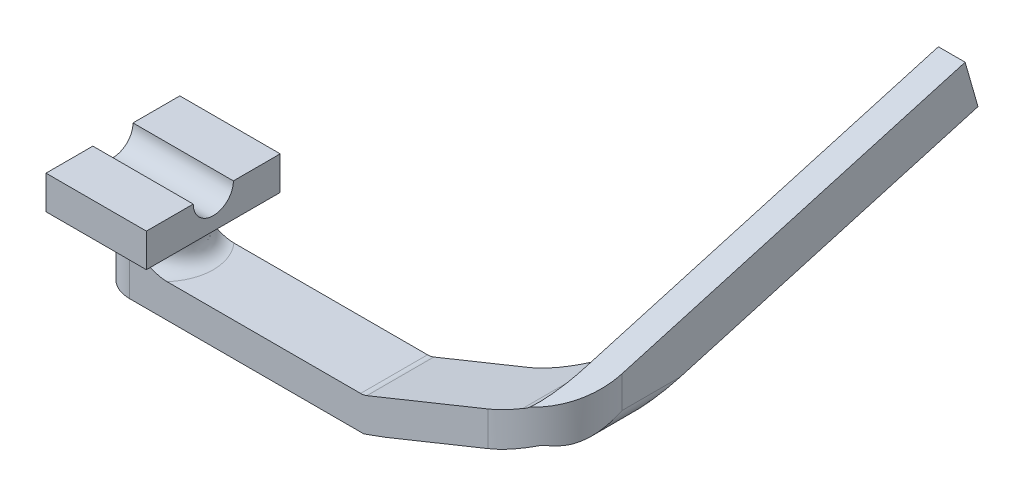
ISO-10303-21;
HEADER;
FILE_DESCRIPTION(('STEP AP214'),'2;1');
FILE_NAME('part.step','',(''),(''),'','','');
FILE_SCHEMA(('AUTOMOTIVE_DESIGN { 1 0 10303 214 1 1 1 1 }'));
ENDSEC;
DATA;
#1=APPLICATION_CONTEXT('core data for automotive mechanical design processes');
#2=APPLICATION_PROTOCOL_DEFINITION('international standard','automotive_design',2000,#1);
#3=PRODUCT_CONTEXT('',#1,'mechanical');
#4=PRODUCT('Part','Part','',(#3));
#5=PRODUCT_RELATED_PRODUCT_CATEGORY('part','',(#4));
#6=PRODUCT_DEFINITION_FORMATION('','',#4);
#7=PRODUCT_DEFINITION_CONTEXT('part definition',#1,'design');
#8=PRODUCT_DEFINITION('design','',#6,#7);
#9=PRODUCT_DEFINITION_SHAPE('','',#8);
#10=(LENGTH_UNIT() NAMED_UNIT(*) SI_UNIT(.MILLI.,.METRE.));
#11=(NAMED_UNIT(*) PLANE_ANGLE_UNIT() SI_UNIT($,.RADIAN.));
#12=(NAMED_UNIT(*) SI_UNIT($,.STERADIAN.) SOLID_ANGLE_UNIT());
#13=UNCERTAINTY_MEASURE_WITH_UNIT(LENGTH_MEASURE(1.E-05),#10,'distance_accuracy_value','');
#14=(GEOMETRIC_REPRESENTATION_CONTEXT(3) GLOBAL_UNCERTAINTY_ASSIGNED_CONTEXT((#13)) GLOBAL_UNIT_ASSIGNED_CONTEXT((#10,
#11,#12)) REPRESENTATION_CONTEXT('',''));
#15=CARTESIAN_POINT('',(0.,0.,0.));
#16=DIRECTION('',(0.,0.,1.));
#17=DIRECTION('',(1.,0.,0.));
#18=AXIS2_PLACEMENT_3D('',#15,#16,#17);
#19=CARTESIAN_POINT('',(0.,0.,0.));
#20=DIRECTION('',(0.,1.,0.));
#21=DIRECTION('',(0.,0.,-1.));
#22=AXIS2_PLACEMENT_3D('',#19,#20,#21);
#23=PLANE('',#22);
#24=DIRECTION('',(0.,0.,-1.));
#25=VECTOR('',#24,1.);
#26=CARTESIAN_POINT('',(-15.,0.,20.));
#27=LINE('',#26,#25);
#28=CARTESIAN_POINT('',(-15.,0.,0.));
#29=VERTEX_POINT('',#28);
#30=CARTESIAN_POINT('',(-15.,0.,-20.));
#31=VERTEX_POINT('',#30);
#32=EDGE_CURVE('E327',#29,#31,#27,.T.);
#33=ORIENTED_EDGE('',*,*,#32,.T.);
#34=DIRECTION('',(1.,0.,0.));
#35=VECTOR('',#34,1.);
#36=CARTESIAN_POINT('',(-15.,0.,-20.));
#37=LINE('',#36,#35);
#38=CARTESIAN_POINT('',(15.,0.,-20.));
#39=VERTEX_POINT('',#38);
#40=EDGE_CURVE('E331',#31,#39,#37,.T.);
#41=ORIENTED_EDGE('',*,*,#40,.T.);
#42=DIRECTION('',(0.,0.,1.));
#43=VECTOR('',#42,1.);
#44=CARTESIAN_POINT('',(15.,0.,20.));
#45=LINE('',#44,#43);
#46=CARTESIAN_POINT('',(15.,0.,0.));
#47=VERTEX_POINT('',#46);
#48=EDGE_CURVE('E321',#39,#47,#45,.T.);
#49=ORIENTED_EDGE('',*,*,#48,.T.);
#50=CARTESIAN_POINT('',(0.,0.,0.));
#51=DIRECTION('',(0.,-1.,0.));
#52=DIRECTION('',(0.,0.,-1.));
#53=AXIS2_PLACEMENT_3D('',#50,#51,#52);
#54=CIRCLE('',#53,15.);
#55=EDGE_CURVE('E351',#29,#47,#54,.T.);
#56=ORIENTED_EDGE('',*,*,#55,.F.);
#57=EDGE_LOOP('',(#33,#41,#49,#56));
#58=FACE_BOUND('',#57,.T.);
#59=ADVANCED_FACE('F43',(#58),#23,.F.);
#60=CARTESIAN_POINT('',(0.,10.,0.));
#61=DIRECTION('',(0.,1.,0.));
#62=DIRECTION('',(0.,0.,-1.));
#63=AXIS2_PLACEMENT_3D('',#60,#61,#62);
#64=PLANE('',#63);
#65=DIRECTION('',(1.,0.,0.));
#66=VECTOR('',#65,1.);
#67=CARTESIAN_POINT('',(-15.,10.,-6.));
#68=LINE('',#67,#66);
#69=CARTESIAN_POINT('',(-15.,10.,-6.));
#70=VERTEX_POINT('',#69);
#71=CARTESIAN_POINT('',(15.,10.,-6.));
#72=VERTEX_POINT('',#71);
#73=EDGE_CURVE('E301',#70,#72,#68,.T.);
#74=ORIENTED_EDGE('',*,*,#73,.T.);
#75=DIRECTION('',(0.,0.,1.));
#76=VECTOR('',#75,1.);
#77=CARTESIAN_POINT('',(15.,10.,20.));
#78=LINE('',#77,#76);
#79=CARTESIAN_POINT('',(15.,10.,-20.));
#80=VERTEX_POINT('',#79);
#81=EDGE_CURVE('E306',#80,#72,#78,.T.);
#82=ORIENTED_EDGE('',*,*,#81,.F.);
#83=DIRECTION('',(1.,0.,0.));
#84=VECTOR('',#83,1.);
#85=CARTESIAN_POINT('',(-15.,10.,-20.));
#86=LINE('',#85,#84);
#87=CARTESIAN_POINT('',(-15.,10.,-20.));
#88=VERTEX_POINT('',#87);
#89=EDGE_CURVE('E317',#88,#80,#86,.T.);
#90=ORIENTED_EDGE('',*,*,#89,.F.);
#91=DIRECTION('',(0.,0.,-1.));
#92=VECTOR('',#91,1.);
#93=CARTESIAN_POINT('',(-15.,10.,20.));
#94=LINE('',#93,#92);
#95=EDGE_CURVE('E313',#70,#88,#94,.T.);
#96=ORIENTED_EDGE('',*,*,#95,.F.);
#97=EDGE_LOOP('',(#74,#82,#90,#96));
#98=FACE_BOUND('',#97,.T.);
#99=ADVANCED_FACE('F401',(#98),#64,.T.);
#100=CARTESIAN_POINT('',(15.,10.,20.));
#101=DIRECTION('',(-1.,0.,0.));
#102=DIRECTION('',(0.,0.,-1.));
#103=AXIS2_PLACEMENT_3D('',#100,#101,#102);
#104=PLANE('',#103);
#105=CARTESIAN_POINT('',(15.,10.,6.));
#106=VERTEX_POINT('',#105);
#107=CARTESIAN_POINT('',(15.,10.,20.));
#108=VERTEX_POINT('',#107);
#109=EDGE_CURVE('E310',#106,#108,#78,.T.);
#110=ORIENTED_EDGE('',*,*,#109,.T.);
#111=DIRECTION('',(0.,-1.,0.));
#112=VECTOR('',#111,1.);
#113=CARTESIAN_POINT('',(15.,10.,20.));
#114=LINE('',#113,#112);
#115=CARTESIAN_POINT('',(15.,0.,20.));
#116=VERTEX_POINT('',#115);
#117=EDGE_CURVE('E340',#108,#116,#114,.T.);
#118=ORIENTED_EDGE('',*,*,#117,.T.);
#119=EDGE_CURVE('E304',#47,#116,#45,.T.);
#120=ORIENTED_EDGE('',*,*,#119,.F.);
#121=ORIENTED_EDGE('',*,*,#48,.F.);
#122=DIRECTION('',(0.,-1.,0.));
#123=VECTOR('',#122,1.);
#124=CARTESIAN_POINT('',(15.,10.,-20.));
#125=LINE('',#124,#123);
#126=EDGE_CURVE('E320',#80,#39,#125,.T.);
#127=ORIENTED_EDGE('',*,*,#126,.F.);
#128=ORIENTED_EDGE('',*,*,#81,.T.);
#129=CARTESIAN_POINT('',(15.,10.,0.));
#130=DIRECTION('',(-1.,0.,0.));
#131=DIRECTION('',(0.,0.,1.));
#132=AXIS2_PLACEMENT_3D('',#129,#130,#131);
#133=CIRCLE('',#132,6.);
#134=EDGE_CURVE('E294',#72,#106,#133,.T.);
#135=ORIENTED_EDGE('',*,*,#134,.T.);
#136=EDGE_LOOP('',(#110,#118,#120,#121,#127,#128,#135));
#137=FACE_BOUND('',#136,.T.);
#138=ADVANCED_FACE('F414',(#137),#104,.F.);
#139=CARTESIAN_POINT('',(-15.,10.,20.));
#140=DIRECTION('',(0.,0.,-1.));
#141=DIRECTION('',(1.,0.,0.));
#142=AXIS2_PLACEMENT_3D('',#139,#140,#141);
#143=PLANE('',#142);
#144=DIRECTION('',(-1.,0.,0.));
#145=VECTOR('',#144,1.);
#146=CARTESIAN_POINT('',(-15.,0.,20.));
#147=LINE('',#146,#145);
#148=CARTESIAN_POINT('',(-15.,0.,20.));
#149=VERTEX_POINT('',#148);
#150=EDGE_CURVE('E324',#116,#149,#147,.T.);
#151=ORIENTED_EDGE('',*,*,#150,.F.);
#152=ORIENTED_EDGE('',*,*,#117,.F.);
#153=DIRECTION('',(-1.,0.,0.));
#154=VECTOR('',#153,1.);
#155=CARTESIAN_POINT('',(-15.,10.,20.));
#156=LINE('',#155,#154);
#157=CARTESIAN_POINT('',(-15.,10.,20.));
#158=VERTEX_POINT('',#157);
#159=EDGE_CURVE('E309',#108,#158,#156,.T.);
#160=ORIENTED_EDGE('',*,*,#159,.T.);
#161=DIRECTION('',(0.,-1.,0.));
#162=VECTOR('',#161,1.);
#163=CARTESIAN_POINT('',(-15.,10.,20.));
#164=LINE('',#163,#162);
#165=EDGE_CURVE('E337',#158,#149,#164,.T.);
#166=ORIENTED_EDGE('',*,*,#165,.T.);
#167=EDGE_LOOP('',(#151,#152,#160,#166));
#168=FACE_BOUND('',#167,.T.);
#169=ADVANCED_FACE('F411',(#168),#143,.F.);
#170=CARTESIAN_POINT('',(-15.,10.,20.));
#171=DIRECTION('',(1.,0.,0.));
#172=DIRECTION('',(0.,0.,1.));
#173=AXIS2_PLACEMENT_3D('',#170,#171,#172);
#174=PLANE('',#173);
#175=ORIENTED_EDGE('',*,*,#95,.T.);
#176=DIRECTION('',(0.,-1.,0.));
#177=VECTOR('',#176,1.);
#178=CARTESIAN_POINT('',(-15.,10.,-20.));
#179=LINE('',#178,#177);
#180=EDGE_CURVE('E335',#88,#31,#179,.T.);
#181=ORIENTED_EDGE('',*,*,#180,.T.);
#182=ORIENTED_EDGE('',*,*,#32,.F.);
#183=EDGE_CURVE('E328',#149,#29,#27,.T.);
#184=ORIENTED_EDGE('',*,*,#183,.F.);
#185=ORIENTED_EDGE('',*,*,#165,.F.);
#186=CARTESIAN_POINT('',(-15.,10.,6.));
#187=VERTEX_POINT('',#186);
#188=EDGE_CURVE('E314',#158,#187,#94,.T.);
#189=ORIENTED_EDGE('',*,*,#188,.T.);
#190=CARTESIAN_POINT('',(-15.,10.,0.));
#191=DIRECTION('',(-1.,0.,0.));
#192=DIRECTION('',(0.,0.,1.));
#193=AXIS2_PLACEMENT_3D('',#190,#191,#192);
#194=CIRCLE('',#193,6.);
#195=EDGE_CURVE('E295',#70,#187,#194,.T.);
#196=ORIENTED_EDGE('',*,*,#195,.F.);
#197=EDGE_LOOP('',(#175,#181,#182,#184,#185,#189,#196));
#198=FACE_BOUND('',#197,.T.);
#199=ADVANCED_FACE('F407',(#198),#174,.F.);
#200=CARTESIAN_POINT('',(-15.,10.,-20.));
#201=DIRECTION('',(0.,0.,1.));
#202=DIRECTION('',(-1.,0.,0.));
#203=AXIS2_PLACEMENT_3D('',#200,#201,#202);
#204=PLANE('',#203);
#205=ORIENTED_EDGE('',*,*,#40,.F.);
#206=ORIENTED_EDGE('',*,*,#180,.F.);
#207=ORIENTED_EDGE('',*,*,#89,.T.);
#208=ORIENTED_EDGE('',*,*,#126,.T.);
#209=EDGE_LOOP('',(#205,#206,#207,#208));
#210=FACE_BOUND('',#209,.T.);
#211=ADVANCED_FACE('F399',(#210),#204,.F.);
#212=DIRECTION('',(1.,0.,0.));
#213=VECTOR('',#212,1.);
#214=CARTESIAN_POINT('',(-15.,10.,6.));
#215=LINE('',#214,#213);
#216=EDGE_CURVE('E298',#187,#106,#215,.T.);
#217=ORIENTED_EDGE('',*,*,#216,.F.);
#218=ORIENTED_EDGE('',*,*,#188,.F.);
#219=ORIENTED_EDGE('',*,*,#159,.F.);
#220=ORIENTED_EDGE('',*,*,#109,.F.);
#221=EDGE_LOOP('',(#217,#218,#219,#220));
#222=FACE_BOUND('',#221,.T.);
#223=ADVANCED_FACE('F396',(#222),#64,.T.);
#224=ORIENTED_EDGE('',*,*,#119,.T.);
#225=ORIENTED_EDGE('',*,*,#150,.T.);
#226=ORIENTED_EDGE('',*,*,#183,.T.);
#227=CARTESIAN_POINT('',(0.,0.,0.));
#228=DIRECTION('',(0.,-1.,0.));
#229=DIRECTION('',(0.,0.,-1.));
#230=AXIS2_PLACEMENT_3D('',#227,#228,#229);
#231=CIRCLE('',#230,15.);
#232=EDGE_CURVE('E349',#47,#29,#231,.T.);
#233=ORIENTED_EDGE('',*,*,#232,.F.);
#234=EDGE_LOOP('',(#224,#225,#226,#233));
#235=FACE_BOUND('',#234,.T.);
#236=ADVANCED_FACE('F394',(#235),#23,.F.);
#237=CARTESIAN_POINT('',(-15.,10.,0.));
#238=DIRECTION('',(1.,0.,0.));
#239=DIRECTION('',(0.,0.,1.));
#240=AXIS2_PLACEMENT_3D('',#237,#238,#239);
#241=CYLINDRICAL_SURFACE('',#240,6.);
#242=ORIENTED_EDGE('',*,*,#134,.F.);
#243=ORIENTED_EDGE('',*,*,#73,.F.);
#244=ORIENTED_EDGE('',*,*,#195,.T.);
#245=ORIENTED_EDGE('',*,*,#216,.T.);
#246=EDGE_LOOP('',(#242,#243,#244,#245));
#247=FACE_BOUND('',#246,.T.);
#248=ADVANCED_FACE('F390',(#247),#241,.F.);
#249=CARTESIAN_POINT('',(0.,-10.,0.));
#250=DIRECTION('',(0.,1.,0.));
#251=DIRECTION('',(0.,0.,-1.));
#252=AXIS2_PLACEMENT_3D('',#249,#250,#251);
#253=CYLINDRICAL_SURFACE('',#252,10.);
#254=DIRECTION('',(0.,1.,0.));
#255=VECTOR('',#254,1.);
#256=CARTESIAN_POINT('',(0.,-20.,-10.));
#257=LINE('',#256,#255);
#258=CARTESIAN_POINT('',(0.,-20.,-10.));
#259=VERTEX_POINT('',#258);
#260=CARTESIAN_POINT('',(0.,-5.,-10.));
#261=VERTEX_POINT('',#260);
#262=EDGE_CURVE('E284',#259,#261,#257,.T.);
#263=ORIENTED_EDGE('',*,*,#262,.F.);
#264=CARTESIAN_POINT('',(0.,-20.,0.));
#265=DIRECTION('',(0.,1.,0.));
#266=DIRECTION('',(0.,0.,1.));
#267=AXIS2_PLACEMENT_3D('',#264,#265,#266);
#268=CIRCLE('',#267,10.);
#269=CARTESIAN_POINT('',(0.,-20.,10.));
#270=VERTEX_POINT('',#269);
#271=EDGE_CURVE('E273',#259,#270,#268,.T.);
#272=ORIENTED_EDGE('',*,*,#271,.T.);
#273=DIRECTION('',(0.,1.,0.));
#274=VECTOR('',#273,1.);
#275=CARTESIAN_POINT('',(0.,-20.,10.));
#276=LINE('',#275,#274);
#277=CARTESIAN_POINT('',(0.,-5.,10.));
#278=VERTEX_POINT('',#277);
#279=EDGE_CURVE('E291',#270,#278,#276,.T.);
#280=ORIENTED_EDGE('',*,*,#279,.T.);
#281=CARTESIAN_POINT('',(0.,-5.,0.));
#282=DIRECTION('',(0.,-1.,0.));
#283=DIRECTION('',(0.,0.,-1.));
#284=AXIS2_PLACEMENT_3D('',#281,#282,#283);
#285=CIRCLE('',#284,10.);
#286=EDGE_CURVE('E346',#261,#278,#285,.F.);
#287=ORIENTED_EDGE('',*,*,#286,.F.);
#288=EDGE_LOOP('',(#263,#272,#280,#287));
#289=FACE_BOUND('',#288,.T.);
#290=ADVANCED_FACE('F387',(#289),#253,.T.);
#291=CARTESIAN_POINT('',(0.,-10.,0.));
#292=DIRECTION('',(0.,-1.,0.));
#293=DIRECTION('',(0.,0.,1.));
#294=AXIS2_PLACEMENT_3D('',#291,#292,#293);
#295=PLANE('',#294);
#296=DIRECTION('',(-1.,0.,0.));
#297=VECTOR('',#296,1.);
#298=CARTESIAN_POINT('',(0.,-10.,-10.));
#299=LINE('',#298,#297);
#300=CARTESIAN_POINT('',(69.0267192124774,-10.,-10.));
#301=VERTEX_POINT('',#300);
#302=CARTESIAN_POINT('',(11.1803398874989,-10.,-10.));
#303=VERTEX_POINT('',#302);
#304=EDGE_CURVE('E277',#301,#303,#299,.T.);
#305=ORIENTED_EDGE('',*,*,#304,.T.);
#306=CARTESIAN_POINT('',(0.,-10.,0.));
#307=DIRECTION('',(0.,1.,0.));
#308=DIRECTION('',(0.,0.,1.));
#309=AXIS2_PLACEMENT_3D('',#306,#307,#308);
#310=CIRCLE('',#309,15.);
#311=CARTESIAN_POINT('',(11.1803398874989,-10.,10.));
#312=VERTEX_POINT('',#311);
#313=EDGE_CURVE('E343',#312,#303,#310,.T.);
#314=ORIENTED_EDGE('',*,*,#313,.F.);
#315=DIRECTION('',(1.,0.,0.));
#316=VECTOR('',#315,1.);
#317=CARTESIAN_POINT('',(0.,-10.,10.));
#318=LINE('',#317,#316);
#319=CARTESIAN_POINT('',(69.0267192124774,-10.,10.));
#320=VERTEX_POINT('',#319);
#321=EDGE_CURVE('E268',#312,#320,#318,.T.);
#322=ORIENTED_EDGE('',*,*,#321,.T.);
#323=DIRECTION('',(0.,0.,-1.));
#324=VECTOR('',#323,1.);
#325=CARTESIAN_POINT('',(69.0267192124774,-10.,0.));
#326=LINE('',#325,#324);
#327=EDGE_CURVE('E476',#301,#320,#326,.F.);
#328=ORIENTED_EDGE('',*,*,#327,.F.);
#329=EDGE_LOOP('',(#305,#314,#322,#328));
#330=FACE_BOUND('',#329,.T.);
#331=ADVANCED_FACE('F381',(#330),#295,.F.);
#332=CARTESIAN_POINT('',(0.,-20.,10.));
#333=DIRECTION('',(0.,0.,-1.));
#334=DIRECTION('',(1.,0.,0.));
#335=AXIS2_PLACEMENT_3D('',#332,#333,#334);
#336=PLANE('',#335);
#337=DIRECTION('',(0.926984589062074,0.375099415677255,0.));
#338=VECTOR('',#337,1.);
#339=CARTESIAN_POINT('',(115.575402138164,8.44184564985946,10.));
#340=LINE('',#339,#338);
#341=CARTESIAN_POINT('',(70.9022162908636,-9.63492294531037,10.));
#342=VERTEX_POINT('',#341);
#343=CARTESIAN_POINT('',(107.143425238512,5.02989075289243,10.));
#344=VERTEX_POINT('',#343);
#345=EDGE_CURVE('E248',#342,#344,#340,.T.);
#346=ORIENTED_EDGE('',*,*,#345,.F.);
#347=CARTESIAN_POINT('',(69.0267192124774,-5.,10.));
#348=DIRECTION('',(0.,0.,1.));
#349=DIRECTION('',(1.,0.,0.));
#350=AXIS2_PLACEMENT_3D('',#347,#348,#349);
#351=CIRCLE('',#350,5.);
#352=EDGE_CURVE('E483',#320,#342,#351,.T.);
#353=ORIENTED_EDGE('',*,*,#352,.F.);
#354=ORIENTED_EDGE('',*,*,#321,.F.);
#355=CARTESIAN_POINT('',(11.1803398874989,-10.,10.));
#356=CARTESIAN_POINT('',(10.8833418810393,-9.99997003760074,10.));
#357=CARTESIAN_POINT('',(10.586723603073,-9.98530721231034,10.));
#358=CARTESIAN_POINT('',(9.99650368330964,-9.92978530908509,10.));
#359=CARTESIAN_POINT('',(9.7028972040913,-9.88897854788572,10.));
#360=CARTESIAN_POINT('',(8.83797284787224,-9.73358908576017,10.));
#361=CARTESIAN_POINT('',(8.27249718229531,-9.5858201950465,10.));
#362=CARTESIAN_POINT('',(7.41580997338313,-9.30445188319732,10.));
#363=CARTESIAN_POINT('',(7.11620351047925,-9.19465956892378,10.));
#364=CARTESIAN_POINT('',(6.52395825241382,-8.95758770188518,10.));
#365=CARTESIAN_POINT('',(6.23131919380735,-8.83030881154199,10.));
#366=CARTESIAN_POINT('',(5.36306780758411,-8.42615010631539,10.));
#367=CARTESIAN_POINT('',(4.79777598845148,-8.12717568823695,10.));
#368=CARTESIAN_POINT('',(3.68544002130761,-7.48711985309111,10.));
#369=CARTESIAN_POINT('',(3.13860738175164,-7.14568176654212,10.));
#370=CARTESIAN_POINT('',(2.06078067546998,-6.43955115794396,10.));
#371=CARTESIAN_POINT('',(1.52977958409374,-6.0748691818554,10.));
#372=CARTESIAN_POINT('',(0.672566535979786,-5.47553184460619,10.));
#373=CARTESIAN_POINT('',(0.344440515491083,-5.24355549883861,10.));
#374=CARTESIAN_POINT('',(0.0108866222775083,-5.00769800477676,10.));
#375=CARTESIAN_POINT('',(0.00544331176375017,-5.00384900298837,10.));
#376=CARTESIAN_POINT('',(0.,-5.,10.));
#377=B_SPLINE_CURVE_WITH_KNOTS('',3,(#355,#356,#357,#358,#359,#360,#361,#362,#363,#364,#365,
#366,#367,#368,#369,#370,#371,#372,#373,#374,#375,#376),.UNSPECIFIED.,.F.,.F.,(4,2,2,2,2,2,2,2,
2,2,4),(0.,0.890035292464629,1.7782950712026,3.52501481011828,4.48189649503703,5.43874194160514,
7.35450080314864,9.28760187109387,11.2198320325017,12.4253863415644,12.4453863415646),.UNSPECIFIED.);
#378=EDGE_CURVE('E363',#278,#312,#377,.F.);
#379=ORIENTED_EDGE('',*,*,#378,.F.);
#380=ORIENTED_EDGE('',*,*,#279,.F.);
#381=DIRECTION('',(1.,0.,0.));
#382=VECTOR('',#381,1.);
#383=CARTESIAN_POINT('',(0.,-20.,10.));
#384=LINE('',#383,#382);
#385=CARTESIAN_POINT('',(70.,-20.,10.));
#386=VERTEX_POINT('',#385);
#387=EDGE_CURVE('E276',#270,#386,#384,.T.);
#388=ORIENTED_EDGE('',*,*,#387,.T.);
#389=DIRECTION('',(-0.939692620785909,-0.342020143325666,0.));
#390=VECTOR('',#389,1.);
#391=CARTESIAN_POINT('',(70.,-20.,10.));
#392=LINE('',#391,#390);
#393=CARTESIAN_POINT('',(76.4278760968653,-17.6604444311898,10.));
#394=VERTEX_POINT('',#393);
#395=EDGE_CURVE('E265',#394,#386,#392,.T.);
#396=ORIENTED_EDGE('',*,*,#395,.F.);
#397=DIRECTION('',(-0.926984589062074,-0.375099415677255,0.));
#398=VECTOR('',#397,1.);
#399=CARTESIAN_POINT('',(76.4278760968653,-17.6604444311898,10.));
#400=LINE('',#399,#398);
#401=CARTESIAN_POINT('',(107.143425238513,-5.23155977530223,10.));
#402=VERTEX_POINT('',#401);
#403=EDGE_CURVE('E251',#402,#394,#400,.T.);
#404=ORIENTED_EDGE('',*,*,#403,.F.);
#405=DIRECTION('',(0.,1.,0.));
#406=VECTOR('',#405,1.);
#407=CARTESIAN_POINT('',(107.143425238512,4.62417681540138,10.));
#408=LINE('',#407,#406);
#409=EDGE_CURVE('E781',#344,#402,#408,.F.);
#410=ORIENTED_EDGE('',*,*,#409,.F.);
#411=EDGE_LOOP('',(#346,#353,#354,#379,#380,#388,#396,#404,#410));
#412=FACE_BOUND('',#411,.T.);
#413=ADVANCED_FACE('F379',(#412),#336,.F.);
#414=CARTESIAN_POINT('',(0.,-20.,-10.));
#415=DIRECTION('',(0.,0.,1.));
#416=DIRECTION('',(-1.,0.,0.));
#417=AXIS2_PLACEMENT_3D('',#414,#415,#416);
#418=PLANE('',#417);
#419=DIRECTION('',(-1.,0.,0.));
#420=VECTOR('',#419,1.);
#421=CARTESIAN_POINT('',(127.143425238512,-0.375823184598619,-10.));
#422=LINE('',#421,#420);
#423=CARTESIAN_POINT('',(119.143425238512,-0.375823184598619,-10.));
#424=VERTEX_POINT('',#423);
#425=CARTESIAN_POINT('',(99.1434252385125,-0.375823184598619,-10.));
#426=VERTEX_POINT('',#425);
#427=EDGE_CURVE('E486',#424,#426,#422,.T.);
#428=ORIENTED_EDGE('',*,*,#427,.F.);
#429=DIRECTION('',(0.926984589062074,0.375099415677255,0.));
#430=VECTOR('',#429,1.);
#431=CARTESIAN_POINT('',(76.4278760968653,-17.6604444311898,-10.));
#432=LINE('',#431,#430);
#433=CARTESIAN_POINT('',(76.4278760968653,-17.6604444311898,-10.));
#434=VERTEX_POINT('',#433);
#435=EDGE_CURVE('E228',#434,#424,#432,.T.);
#436=ORIENTED_EDGE('',*,*,#435,.F.);
#437=DIRECTION('',(0.939692620785909,0.342020143325666,0.));
#438=VECTOR('',#437,1.);
#439=CARTESIAN_POINT('',(70.,-20.,-10.));
#440=LINE('',#439,#438);
#441=CARTESIAN_POINT('',(70.,-20.,-10.));
#442=VERTEX_POINT('',#441);
#443=EDGE_CURVE('E264',#442,#434,#440,.T.);
#444=ORIENTED_EDGE('',*,*,#443,.F.);
#445=DIRECTION('',(-1.,0.,0.));
#446=VECTOR('',#445,1.);
#447=CARTESIAN_POINT('',(0.,-20.,-10.));
#448=LINE('',#447,#446);
#449=EDGE_CURVE('E282',#442,#259,#448,.T.);
#450=ORIENTED_EDGE('',*,*,#449,.T.);
#451=ORIENTED_EDGE('',*,*,#262,.T.);
#452=CARTESIAN_POINT('',(11.1803398874989,-10.,-10.));
#453=CARTESIAN_POINT('',(10.8833418810393,-9.99997003760074,-10.));
#454=CARTESIAN_POINT('',(10.586723603073,-9.98530721231034,-10.));
#455=CARTESIAN_POINT('',(9.99650368330964,-9.92978530908509,-10.));
#456=CARTESIAN_POINT('',(9.7028972040913,-9.88897854788572,-10.));
#457=CARTESIAN_POINT('',(8.83797284787224,-9.73358908576017,-10.));
#458=CARTESIAN_POINT('',(8.27249718229531,-9.5858201950465,-10.));
#459=CARTESIAN_POINT('',(7.41580997338313,-9.30445188319732,-10.));
#460=CARTESIAN_POINT('',(7.11620351047925,-9.19465956892378,-10.));
#461=CARTESIAN_POINT('',(6.52395825241382,-8.95758770188518,-10.));
#462=CARTESIAN_POINT('',(6.23131919380735,-8.83030881154199,-10.));
#463=CARTESIAN_POINT('',(5.36306780758411,-8.42615010631539,-10.));
#464=CARTESIAN_POINT('',(4.79777598845148,-8.12717568823695,-10.));
#465=CARTESIAN_POINT('',(3.68544002130761,-7.48711985309111,-10.));
#466=CARTESIAN_POINT('',(3.13860738175164,-7.14568176654212,-10.));
#467=CARTESIAN_POINT('',(2.06078067546998,-6.43955115794396,-10.));
#468=CARTESIAN_POINT('',(1.52977958409374,-6.0748691818554,-10.));
#469=CARTESIAN_POINT('',(0.672566535979786,-5.47553184460619,-10.));
#470=CARTESIAN_POINT('',(0.344440515491083,-5.24355549883861,-10.));
#471=CARTESIAN_POINT('',(0.0108866222775083,-5.00769800477676,-10.));
#472=CARTESIAN_POINT('',(0.00544331176375017,-5.00384900298837,-10.));
#473=CARTESIAN_POINT('',(0.,-5.,-10.));
#474=B_SPLINE_CURVE_WITH_KNOTS('',3,(#452,#453,#454,#455,#456,#457,#458,#459,#460,#461,#462,
#463,#464,#465,#466,#467,#468,#469,#470,#471,#472,#473),.UNSPECIFIED.,.F.,.F.,(4,2,2,2,2,2,2,2,
2,2,4),(0.,0.890035292464629,1.7782950712026,3.52501481011828,4.48189649503703,5.43874194160514,
7.35450080314864,9.28760187109387,11.2198320325017,12.4253863415644,12.4453863415646),.UNSPECIFIED.);
#475=EDGE_CURVE('E354',#303,#261,#474,.T.);
#476=ORIENTED_EDGE('',*,*,#475,.F.);
#477=ORIENTED_EDGE('',*,*,#304,.F.);
#478=CARTESIAN_POINT('',(69.0267192124774,-5.,-9.99999999999999));
#479=DIRECTION('',(0.,0.,-1.));
#480=DIRECTION('',(-1.,0.,0.));
#481=AXIS2_PLACEMENT_3D('',#478,#479,#480);
#482=CIRCLE('',#481,5.);
#483=CARTESIAN_POINT('',(70.9022162908637,-9.63492294531037,-10.));
#484=VERTEX_POINT('',#483);
#485=EDGE_CURVE('E481',#484,#301,#482,.T.);
#486=ORIENTED_EDGE('',*,*,#485,.F.);
#487=DIRECTION('',(-0.926984589062074,-0.375099415677255,0.));
#488=VECTOR('',#487,1.);
#489=CARTESIAN_POINT('',(115.575402138164,8.44184564985946,-10.));
#490=LINE('',#489,#488);
#491=CARTESIAN_POINT('',(99.1434252385125,1.79273302575669,-10.));
#492=VERTEX_POINT('',#491);
#493=EDGE_CURVE('E255',#492,#484,#490,.T.);
#494=ORIENTED_EDGE('',*,*,#493,.F.);
#495=DIRECTION('',(0.,1.,0.));
#496=VECTOR('',#495,1.);
#497=CARTESIAN_POINT('',(99.1434252385125,13.2324032540288,-10.));
#498=LINE('',#497,#496);
#499=EDGE_CURVE('E488',#426,#492,#498,.T.);
#500=ORIENTED_EDGE('',*,*,#499,.F.);
#501=EDGE_LOOP('',(#428,#436,#444,#450,#451,#476,#477,#486,#494,#500));
#502=FACE_BOUND('',#501,.T.);
#503=ADVANCED_FACE('F374',(#502),#418,.F.);
#504=CARTESIAN_POINT('',(0.,-20.,0.));
#505=DIRECTION('',(0.,-1.,0.));
#506=DIRECTION('',(0.,0.,1.));
#507=AXIS2_PLACEMENT_3D('',#504,#505,#506);
#508=PLANE('',#507);
#509=ORIENTED_EDGE('',*,*,#271,.F.);
#510=ORIENTED_EDGE('',*,*,#449,.F.);
#511=DIRECTION('',(0.,0.,-1.));
#512=VECTOR('',#511,1.);
#513=CARTESIAN_POINT('',(70.,-20.,-10.));
#514=LINE('',#513,#512);
#515=EDGE_CURVE('E280',#386,#442,#514,.T.);
#516=ORIENTED_EDGE('',*,*,#515,.F.);
#517=ORIENTED_EDGE('',*,*,#387,.F.);
#518=EDGE_LOOP('',(#509,#510,#516,#517));
#519=FACE_BOUND('',#518,.T.);
#520=ADVANCED_FACE('F378',(#519),#508,.T.);
#521=CARTESIAN_POINT('',(70.,-20.,21.8877075635571));
#522=DIRECTION('',(0.342020143325666,-0.939692620785909,0.));
#523=DIRECTION('',(0.939692620785909,0.342020143325666,0.));
#524=AXIS2_PLACEMENT_3D('',#521,#522,#523);
#525=PLANE('',#524);
#526=ORIENTED_EDGE('',*,*,#395,.T.);
#527=ORIENTED_EDGE('',*,*,#515,.T.);
#528=ORIENTED_EDGE('',*,*,#443,.T.);
#529=DIRECTION('',(0.,0.,-1.));
#530=VECTOR('',#529,1.);
#531=CARTESIAN_POINT('',(76.4278760968653,-17.6604444311898,21.8877075635571));
#532=LINE('',#531,#530);
#533=EDGE_CURVE('E269',#394,#434,#532,.T.);
#534=ORIENTED_EDGE('',*,*,#533,.F.);
#535=EDGE_LOOP('',(#526,#527,#528,#534));
#536=FACE_BOUND('',#535,.T.);
#537=ADVANCED_FACE('F557',(#536),#525,.T.);
#538=CARTESIAN_POINT('',(115.575402138164,8.44184564985946,65.6453573233968));
#539=DIRECTION('',(-0.375099415677255,0.926984589062074,0.));
#540=DIRECTION('',(-0.926984589062074,-0.375099415677255,0.));
#541=AXIS2_PLACEMENT_3D('',#538,#539,#540);
#542=PLANE('',#541);
#543=DIRECTION('',(0.,0.,-1.));
#544=VECTOR('',#543,1.);
#545=CARTESIAN_POINT('',(115.575402138164,8.44184564985946,65.6453573233968));
#546=LINE('',#545,#544);
#547=CARTESIAN_POINT('',(115.575402138164,8.44184564985946,8.13564902515892));
#548=VERTEX_POINT('',#547);
#549=CARTESIAN_POINT('',(115.575402138164,8.44184564985946,-18.5986783586576));
#550=VERTEX_POINT('',#549);
#551=EDGE_CURVE('E252',#548,#550,#546,.T.);
#552=ORIENTED_EDGE('',*,*,#551,.T.);
#553=CARTESIAN_POINT('',(99.1434252385125,1.7927330257567,-30.));
#554=DIRECTION('',(0.375099415677255,-0.926984589062074,0.));
#555=DIRECTION('',(-0.926984589062074,-0.375099415677255,0.));
#556=AXIS2_PLACEMENT_3D('',#553,#554,#555);
#557=ELLIPSE('',#556,21.5753317110008,20.);
#558=EDGE_CURVE('E520',#492,#550,#557,.F.);
#559=ORIENTED_EDGE('',*,*,#558,.F.);
#560=ORIENTED_EDGE('',*,*,#493,.T.);
#561=DIRECTION('',(0.,0.,-1.));
#562=VECTOR('',#561,1.);
#563=CARTESIAN_POINT('',(70.9022162908637,-9.63492294531037,65.6453573233968));
#564=LINE('',#563,#562);
#565=EDGE_CURVE('E474',#342,#484,#564,.T.);
#566=ORIENTED_EDGE('',*,*,#565,.F.);
#567=ORIENTED_EDGE('',*,*,#345,.T.);
#568=CARTESIAN_POINT('',(107.143425238512,5.02989075289243,-10.));
#569=DIRECTION('',(0.375099415677255,-0.926984589062074,0.));
#570=DIRECTION('',(-0.926984589062074,-0.375099415677255,0.));
#571=AXIS2_PLACEMENT_3D('',#568,#569,#570);
#572=ELLIPSE('',#571,21.5753317110008,20.);
#573=EDGE_CURVE('E504',#548,#344,#572,.T.);
#574=ORIENTED_EDGE('',*,*,#573,.F.);
#575=EDGE_LOOP('',(#552,#559,#560,#566,#567,#574));
#576=FACE_BOUND('',#575,.T.);
#577=ADVANCED_FACE('F553',(#576),#542,.T.);
#578=CARTESIAN_POINT('',(76.4278760968653,-17.6604444311898,65.6453573233968));
#579=DIRECTION('',(0.375099415677255,-0.926984589062074,0.));
#580=DIRECTION('',(0.926984589062074,0.375099415677255,0.));
#581=AXIS2_PLACEMENT_3D('',#578,#579,#580);
#582=PLANE('',#581);
#583=ORIENTED_EDGE('',*,*,#403,.T.);
#584=ORIENTED_EDGE('',*,*,#533,.T.);
#585=ORIENTED_EDGE('',*,*,#435,.T.);
#586=DIRECTION('',(0.,0.,-1.));
#587=VECTOR('',#586,1.);
#588=CARTESIAN_POINT('',(119.143425238512,-0.375823184598619,65.6453573233968));
#589=LINE('',#588,#587);
#590=CARTESIAN_POINT('',(119.143425238512,-0.375823184598619,6.));
#591=VERTEX_POINT('',#590);
#592=EDGE_CURVE('E258',#591,#424,#589,.T.);
#593=ORIENTED_EDGE('',*,*,#592,.F.);
#594=CARTESIAN_POINT('',(107.143425238512,-5.23155977530223,-10.));
#595=DIRECTION('',(-0.375099415677255,0.926984589062074,0.));
#596=DIRECTION('',(-0.926984589062074,-0.375099415677255,0.));
#597=AXIS2_PLACEMENT_3D('',#594,#595,#596);
#598=ELLIPSE('',#597,21.5753317110008,20.);
#599=EDGE_CURVE('E773',#402,#591,#598,.T.);
#600=ORIENTED_EDGE('',*,*,#599,.F.);
#601=EDGE_LOOP('',(#583,#584,#585,#593,#600));
#602=FACE_BOUND('',#601,.T.);
#603=ADVANCED_FACE('F556',(#602),#582,.T.);
#604=CARTESIAN_POINT('',(119.143425238512,0.,0.));
#605=DIRECTION('',(1.,0.,0.));
#606=DIRECTION('',(0.,0.,1.));
#607=AXIS2_PLACEMENT_3D('',#604,#605,#606);
#608=PLANE('',#607);
#609=DIRECTION('',(0.,0.,-1.));
#610=VECTOR('',#609,1.);
#611=CARTESIAN_POINT('',(119.143425238512,13.2324032540288,0.));
#612=LINE('',#611,#610);
#613=CARTESIAN_POINT('',(119.143425238512,13.2324032540288,-6.7795750899369));
#614=VERTEX_POINT('',#613);
#615=CARTESIAN_POINT('',(119.143425238512,13.2324032540288,-30.));
#616=VERTEX_POINT('',#615);
#617=EDGE_CURVE('E472',#614,#616,#612,.T.);
#618=ORIENTED_EDGE('',*,*,#617,.F.);
#619=DIRECTION('',(0.,0.275225983809201,-0.961379559714194));
#620=VECTOR('',#619,1.);
#621=CARTESIAN_POINT('',(119.143425238512,8.42870734083388,10.));
#622=LINE('',#621,#620);
#623=CARTESIAN_POINT('',(119.143425238512,43.5123460607332,-112.549087404083));
#624=VERTEX_POINT('',#623);
#625=EDGE_CURVE('E242',#614,#624,#622,.T.);
#626=ORIENTED_EDGE('',*,*,#625,.T.);
#627=DIRECTION('',(0.,-0.961379559714194,-0.275225983809202));
#628=VECTOR('',#627,1.);
#629=CARTESIAN_POINT('',(119.143425238512,30.0828202279349,-116.393723398343));
#630=LINE('',#629,#628);
#631=CARTESIAN_POINT('',(119.143425238512,30.0828202279349,-116.393723398343));
#632=VERTEX_POINT('',#631);
#633=EDGE_CURVE('E224',#624,#632,#630,.T.);
#634=ORIENTED_EDGE('',*,*,#633,.T.);
#635=DIRECTION('',(0.,-0.275225983809201,0.961379559714194));
#636=VECTOR('',#635,1.);
#637=CARTESIAN_POINT('',(119.143425238512,-0.375823184598619,-10.));
#638=LINE('',#637,#636);
#639=CARTESIAN_POINT('',(119.143425238512,5.34982348696204,-30.));
#640=VERTEX_POINT('',#639);
#641=EDGE_CURVE('E236',#632,#640,#638,.T.);
#642=ORIENTED_EDGE('',*,*,#641,.T.);
#643=DIRECTION('',(0.,1.,0.));
#644=VECTOR('',#643,1.);
#645=CARTESIAN_POINT('',(119.143425238512,-0.375823184598618,-30.));
#646=LINE('',#645,#644);
#647=EDGE_CURVE('E491',#616,#640,#646,.F.);
#648=ORIENTED_EDGE('',*,*,#647,.F.);
#649=EDGE_LOOP('',(#618,#626,#634,#642,#648));
#650=FACE_BOUND('',#649,.T.);
#651=ADVANCED_FACE('F552',(#650),#608,.F.);
#652=CARTESIAN_POINT('',(127.143425238512,8.42870734083388,10.));
#653=DIRECTION('',(0.,-0.961379559714194,-0.275225983809201));
#654=DIRECTION('',(0.,-0.275225983809201,0.961379559714194));
#655=AXIS2_PLACEMENT_3D('',#652,#653,#654);
#656=PLANE('',#655);
#657=DIRECTION('',(0.,0.275225983809201,-0.961379559714194));
#658=VECTOR('',#657,1.);
#659=CARTESIAN_POINT('',(127.143425238512,8.42870734083388,10.));
#660=LINE('',#659,#658);
#661=CARTESIAN_POINT('',(127.143425238512,14.1543540123945,-10.));
#662=VERTEX_POINT('',#661);
#663=CARTESIAN_POINT('',(127.143425238512,43.5123460607332,-112.549087404083));
#664=VERTEX_POINT('',#663);
#665=EDGE_CURVE('E214',#662,#664,#660,.T.);
#666=ORIENTED_EDGE('',*,*,#665,.T.);
#667=DIRECTION('',(-1.,0.,0.));
#668=VECTOR('',#667,1.);
#669=CARTESIAN_POINT('',(127.143425238512,43.5123460607332,-112.549087404083));
#670=LINE('',#669,#668);
#671=EDGE_CURVE('E221',#664,#624,#670,.T.);
#672=ORIENTED_EDGE('',*,*,#671,.T.);
#673=ORIENTED_EDGE('',*,*,#625,.F.);
#674=CARTESIAN_POINT('',(114.143425238512,13.2324032540288,-6.7795750899369));
#675=DIRECTION('',(0.,0.961379559714194,0.275225983809201));
#676=DIRECTION('',(0.,0.275225983809201,-0.961379559714194));
#677=AXIS2_PLACEMENT_3D('',#674,#675,#676);
#678=ELLIPSE('',#677,18.1668893714128,5.);
#679=CARTESIAN_POINT('',(117.079552527233,9.18528618821147,7.35722830702938));
#680=VERTEX_POINT('',#679);
#681=EDGE_CURVE('E479',#680,#614,#678,.T.);
#682=ORIENTED_EDGE('',*,*,#681,.F.);
#683=CARTESIAN_POINT('',(107.143425238512,14.1543540123945,-10.));
#684=DIRECTION('',(0.,0.961379559714194,0.275225983809201));
#685=DIRECTION('',(0.,-0.275225983809201,0.961379559714194));
#686=AXIS2_PLACEMENT_3D('',#683,#684,#685);
#687=ELLIPSE('',#686,20.803437932408,20.);
#688=EDGE_CURVE('E235',#662,#680,#687,.F.);
#689=ORIENTED_EDGE('',*,*,#688,.F.);
#690=EDGE_LOOP('',(#666,#672,#673,#682,#689));
#691=FACE_BOUND('',#690,.T.);
#692=ADVANCED_FACE('F232',(#691),#656,.F.);
#693=CARTESIAN_POINT('',(127.143425238512,30.0828202279349,-116.393723398343));
#694=DIRECTION('',(0.,-0.275225983809202,0.961379559714194));
#695=DIRECTION('',(0.,0.961379559714194,0.275225983809202));
#696=AXIS2_PLACEMENT_3D('',#693,#694,#695);
#697=PLANE('',#696);
#698=ORIENTED_EDGE('',*,*,#633,.F.);
#699=ORIENTED_EDGE('',*,*,#671,.F.);
#700=DIRECTION('',(0.,-0.961379559714194,-0.275225983809202));
#701=VECTOR('',#700,1.);
#702=CARTESIAN_POINT('',(127.143425238512,30.0828202279349,-116.393723398343));
#703=LINE('',#702,#701);
#704=CARTESIAN_POINT('',(127.143425238512,30.0828202279349,-116.393723398343));
#705=VERTEX_POINT('',#704);
#706=EDGE_CURVE('E209',#664,#705,#703,.T.);
#707=ORIENTED_EDGE('',*,*,#706,.T.);
#708=DIRECTION('',(-1.,0.,0.));
#709=VECTOR('',#708,1.);
#710=CARTESIAN_POINT('',(127.143425238512,30.0828202279349,-116.393723398343));
#711=LINE('',#710,#709);
#712=EDGE_CURVE('E229',#705,#632,#711,.T.);
#713=ORIENTED_EDGE('',*,*,#712,.T.);
#714=EDGE_LOOP('',(#698,#699,#707,#713));
#715=FACE_BOUND('',#714,.T.);
#716=ADVANCED_FACE('F222',(#715),#697,.F.);
#717=CARTESIAN_POINT('',(127.143425238512,-0.375823184598619,-10.));
#718=DIRECTION('',(0.,0.961379559714194,0.275225983809201));
#719=DIRECTION('',(0.,0.275225983809201,-0.961379559714194));
#720=AXIS2_PLACEMENT_3D('',#717,#718,#719);
#721=PLANE('',#720);
#722=DIRECTION('',(-1.,0.,0.));
#723=VECTOR('',#722,1.);
#724=CARTESIAN_POINT('',(127.143425238512,-0.375823184598619,-10.));
#725=LINE('',#724,#723);
#726=CARTESIAN_POINT('',(122.143425238512,-0.375823184598619,-10.));
#727=VERTEX_POINT('',#726);
#728=EDGE_CURVE('E59',#727,#424,#725,.T.);
#729=ORIENTED_EDGE('',*,*,#728,.T.);
#730=ORIENTED_EDGE('',*,*,#427,.T.);
#731=CARTESIAN_POINT('',(99.1434252385125,5.34982348696204,-30.));
#732=DIRECTION('',(0.,-0.961379559714194,-0.275225983809201));
#733=DIRECTION('',(0.,-0.275225983809201,0.961379559714194));
#734=AXIS2_PLACEMENT_3D('',#731,#732,#733);
#735=ELLIPSE('',#734,20.803437932408,20.);
#736=EDGE_CURVE('E11',#640,#426,#735,.T.);
#737=ORIENTED_EDGE('',*,*,#736,.F.);
#738=ORIENTED_EDGE('',*,*,#641,.F.);
#739=ORIENTED_EDGE('',*,*,#712,.F.);
#740=DIRECTION('',(0.,-0.275225983809201,0.961379559714194));
#741=VECTOR('',#740,1.);
#742=CARTESIAN_POINT('',(127.143425238512,-0.375823184598619,-10.));
#743=LINE('',#742,#741);
#744=CARTESIAN_POINT('',(127.143425238512,4.62417681540138,-27.4652761052653));
#745=VERTEX_POINT('',#744);
#746=EDGE_CURVE('E216',#705,#745,#743,.T.);
#747=ORIENTED_EDGE('',*,*,#746,.T.);
#748=CARTESIAN_POINT('',(122.143425238512,4.62417681540138,-27.4652761052653));
#749=DIRECTION('',(0.,-0.961379559714194,-0.275225983809201));
#750=DIRECTION('',(0.,0.275225983809201,-0.961379559714194));
#751=AXIS2_PLACEMENT_3D('',#748,#749,#750);
#752=ELLIPSE('',#751,18.1668893714128,5.);
#753=EDGE_CURVE('E468',#727,#745,#752,.F.);
#754=ORIENTED_EDGE('',*,*,#753,.F.);
#755=EDGE_LOOP('',(#729,#730,#737,#738,#739,#747,#754));
#756=FACE_BOUND('',#755,.T.);
#757=ADVANCED_FACE('F537',(#756),#721,.F.);
#758=CARTESIAN_POINT('',(127.143425238512,-0.375823184598619,10.));
#759=DIRECTION('',(0.,1.,0.));
#760=DIRECTION('',(0.,0.,-1.));
#761=AXIS2_PLACEMENT_3D('',#758,#759,#760);
#762=PLANE('',#761);
#763=ORIENTED_EDGE('',*,*,#592,.T.);
#764=ORIENTED_EDGE('',*,*,#728,.F.);
#765=DIRECTION('',(0.,0.,1.));
#766=VECTOR('',#765,1.);
#767=CARTESIAN_POINT('',(122.143425238512,-0.375823184598619,-10.));
#768=LINE('',#767,#766);
#769=CARTESIAN_POINT('',(122.143425238512,-0.375823184598619,3.22875655532295));
#770=VERTEX_POINT('',#769);
#771=EDGE_CURVE('E464',#770,#727,#768,.F.);
#772=ORIENTED_EDGE('',*,*,#771,.F.);
#773=CARTESIAN_POINT('',(107.143425238512,-0.375823184598619,-10.));
#774=DIRECTION('',(0.,-1.,0.));
#775=DIRECTION('',(0.,0.,-1.));
#776=AXIS2_PLACEMENT_3D('',#773,#774,#775);
#777=CIRCLE('',#776,20.);
#778=EDGE_CURVE('E771',#591,#770,#777,.F.);
#779=ORIENTED_EDGE('',*,*,#778,.F.);
#780=EDGE_LOOP('',(#763,#764,#772,#779));
#781=FACE_BOUND('',#780,.T.);
#782=ADVANCED_FACE('F539',(#781),#762,.F.);
#783=CARTESIAN_POINT('',(127.143425238512,0.,0.));
#784=DIRECTION('',(1.,0.,0.));
#785=DIRECTION('',(0.,0.,1.));
#786=AXIS2_PLACEMENT_3D('',#783,#784,#785);
#787=PLANE('',#786);
#788=DIRECTION('',(0.,0.,1.));
#789=VECTOR('',#788,1.);
#790=CARTESIAN_POINT('',(127.143425238512,4.62417681540138,10.));
#791=LINE('',#790,#789);
#792=CARTESIAN_POINT('',(127.143425238512,4.62417681540138,-10.));
#793=VERTEX_POINT('',#792);
#794=EDGE_CURVE('E462',#745,#793,#791,.T.);
#795=ORIENTED_EDGE('',*,*,#794,.F.);
#796=ORIENTED_EDGE('',*,*,#746,.F.);
#797=ORIENTED_EDGE('',*,*,#706,.F.);
#798=ORIENTED_EDGE('',*,*,#665,.F.);
#799=DIRECTION('',(0.,1.,0.));
#800=VECTOR('',#799,1.);
#801=CARTESIAN_POINT('',(127.143425238512,8.42870734083388,-10.));
#802=LINE('',#801,#800);
#803=EDGE_CURVE('E494',#793,#662,#802,.T.);
#804=ORIENTED_EDGE('',*,*,#803,.F.);
#805=EDGE_LOOP('',(#795,#796,#797,#798,#804));
#806=FACE_BOUND('',#805,.T.);
#807=ADVANCED_FACE('F211',(#806),#787,.T.);
#808=CARTESIAN_POINT('',(0.,-5.,0.));
#809=DIRECTION('',(0.,1.,0.));
#810=DIRECTION('',(0.,0.,-1.));
#811=AXIS2_PLACEMENT_3D('',#808,#809,#810);
#812=TOROIDAL_SURFACE('',#811,15.,5.);
#813=ORIENTED_EDGE('',*,*,#232,.T.);
#814=ORIENTED_EDGE('',*,*,#55,.T.);
#815=EDGE_LOOP('',(#813,#814));
#816=FACE_BOUND('',#815,.T.);
#817=CARTESIAN_POINT('',(0.,-5.,0.));
#818=DIRECTION('',(0.,-1.,0.));
#819=DIRECTION('',(0.,0.,-1.));
#820=AXIS2_PLACEMENT_3D('',#817,#818,#819);
#821=CIRCLE('',#820,10.);
#822=EDGE_CURVE('E244',#278,#261,#821,.F.);
#823=ORIENTED_EDGE('',*,*,#822,.T.);
#824=ORIENTED_EDGE('',*,*,#286,.T.);
#825=EDGE_LOOP('',(#823,#824));
#826=FACE_BOUND('',#825,.T.);
#827=ADVANCED_FACE('F441',(#816,#826),#812,.F.);
#828=CARTESIAN_POINT('',(0.,-5.,0.));
#829=DIRECTION('',(0.,-1.,0.));
#830=DIRECTION('',(0.,0.,1.));
#831=AXIS2_PLACEMENT_3D('',#828,#829,#830);
#832=TOROIDAL_SURFACE('',#831,15.,5.);
#833=ORIENTED_EDGE('',*,*,#378,.T.);
#834=ORIENTED_EDGE('',*,*,#313,.T.);
#835=ORIENTED_EDGE('',*,*,#475,.T.);
#836=ORIENTED_EDGE('',*,*,#822,.F.);
#837=EDGE_LOOP('',(#833,#834,#835,#836));
#838=FACE_BOUND('',#837,.T.);
#839=ADVANCED_FACE('F370',(#838),#832,.F.);
#840=CARTESIAN_POINT('',(122.143425238512,4.62417681540138,0.));
#841=DIRECTION('',(0.,0.,-1.));
#842=DIRECTION('',(1.,0.,0.));
#843=AXIS2_PLACEMENT_3D('',#840,#841,#842);
#844=CYLINDRICAL_SURFACE('',#843,5.);
#845=ORIENTED_EDGE('',*,*,#771,.T.);
#846=ORIENTED_EDGE('',*,*,#753,.T.);
#847=ORIENTED_EDGE('',*,*,#794,.T.);
#848=CARTESIAN_POINT('',(122.143425238512,-0.375823184598619,3.22875655532295));
#849=CARTESIAN_POINT('',(122.251089269353,-0.375816570432875,3.10668100893426));
#850=CARTESIAN_POINT('',(122.357232571211,-0.372346608374878,2.98331718277754));
#851=CARTESIAN_POINT('',(122.566284883523,-0.359011938714485,2.73427672705862));
#852=CARTESIAN_POINT('',(122.669194862389,-0.349149165339802,2.60860080822128));
#853=CARTESIAN_POINT('',(122.972470261211,-0.310817734863988,2.22890391172398));
#854=CARTESIAN_POINT('',(123.167820291139,-0.273601575606115,1.97171545514092));
#855=CARTESIAN_POINT('',(123.542667006666,-0.179899610844632,1.45279693880264));
#856=CARTESIAN_POINT('',(123.722279412538,-0.123572527187992,1.19112062606));
#857=CARTESIAN_POINT('',(124.067248807096,0.00543008816699377,0.662267764406019));
#858=CARTESIAN_POINT('',(124.232596325569,0.0781163666616309,0.395087705230606));
#859=CARTESIAN_POINT('',(124.636905073687,0.281533054255698,-0.293584525688986));
#860=CARTESIAN_POINT('',(124.865634528972,0.422056515941553,-0.718219506918755));
#861=CARTESIAN_POINT('',(125.288737406549,0.728631281510358,-1.57525896655274));
#862=CARTESIAN_POINT('',(125.483098719559,0.894691544659666,-2.00766612452586));
#863=CARTESIAN_POINT('',(125.839252504431,1.2472051167493,-2.88036213949313));
#864=CARTESIAN_POINT('',(126.000876163429,1.43375684140601,-3.32067970871867));
#865=CARTESIAN_POINT('',(126.291264172001,1.82165641847386,-4.20542984859927));
#866=CARTESIAN_POINT('',(126.4200341683,2.0230017205654,-4.64986169848601));
#867=CARTESIAN_POINT('',(126.635012160235,2.41710529415476,-5.49981497575582));
#868=CARTESIAN_POINT('',(126.724083141779,2.60889170801838,-5.90506705713204));
#869=CARTESIAN_POINT('',(126.876503620068,2.99881412073909,-6.71725449126454));
#870=CARTESIAN_POINT('',(126.939851838609,3.19695043460477,-7.12418992665451));
#871=CARTESIAN_POINT('',(127.091609222983,3.7964781072532,-8.34453579083486));
#872=CARTESIAN_POINT('',(127.142379152727,4.20421570145692,-9.16007709244472));
#873=CARTESIAN_POINT('',(127.143419901756,4.61574412792027,-9.98313461673863));
#874=CARTESIAN_POINT('',(127.143425234888,4.61996049940305,-9.99156735956937));
#875=CARTESIAN_POINT('',(127.143425238512,4.62417681540138,-10.));
#876=B_SPLINE_CURVE_WITH_KNOTS('',3,(#848,#849,#850,#851,#852,#853,#854,#855,#856,#857,#858,
#859,#860,#861,#862,#863,#864,#865,#866,#867,#868,#869,#870,#871,#872,#873,#874,#875),
.UNSPECIFIED.,.F.,.F.,(4,2,2,2,2,2,2,2,2,2,2,2,2,4),(0.,0.488193849119188,0.976240057783821,
1.95034699461195,2.9165540599089,3.88339771500229,5.38821069481491,6.89355282894273,
8.40647006386519,9.91912709059489,11.2895968677426,12.6601347373092,15.3924368215511,
15.4207210973241),.UNSPECIFIED.);
#877=EDGE_CURVE('E770',#770,#793,#876,.T.);
#878=ORIENTED_EDGE('',*,*,#877,.F.);
#879=EDGE_LOOP('',(#845,#846,#847,#878));
#880=FACE_BOUND('',#879,.T.);
#881=ADVANCED_FACE('F512',(#880),#844,.T.);
#882=CARTESIAN_POINT('',(114.143425238512,13.2324032540288,19.5122065010593));
#883=DIRECTION('',(0.,0.,-1.));
#884=DIRECTION('',(1.,0.,0.));
#885=AXIS2_PLACEMENT_3D('',#882,#883,#884);
#886=CYLINDRICAL_SURFACE('',#885,5.);
#887=ORIENTED_EDGE('',*,*,#681,.T.);
#888=ORIENTED_EDGE('',*,*,#617,.T.);
#889=CARTESIAN_POINT('',(115.575402138164,8.44184564985946,-18.5986783586576));
#890=CARTESIAN_POINT('',(115.692294159128,8.47679900541845,-18.7671432451283));
#891=CARTESIAN_POINT('',(115.806210470808,8.51549830667721,-18.9368585583163));
#892=CARTESIAN_POINT('',(116.028033932301,8.59965599820502,-19.2784596495123));
#893=CARTESIAN_POINT('',(116.135942774259,8.64511247178148,-19.4503447994288));
#894=CARTESIAN_POINT('',(116.34558423935,8.74199119836466,-19.7957616706886));
#895=CARTESIAN_POINT('',(116.447326894296,8.79340334231113,-19.9692901558308));
#896=CARTESIAN_POINT('',(116.644852417069,8.90163607680079,-20.3180467887888));
#897=CARTESIAN_POINT('',(116.740634803258,8.95845710348886,-20.4932750726428));
#898=CARTESIAN_POINT('',(117.018532384294,9.13582063855466,-21.0201402479193));
#899=CARTESIAN_POINT('',(117.191853627687,9.26357417483603,-21.3740411730422));
#900=CARTESIAN_POINT('',(117.515438754145,9.53455601632138,-22.0865691281818));
#901=CARTESIAN_POINT('',(117.665688259776,9.6777938768063,-22.4451989551523));
#902=CARTESIAN_POINT('',(118.030587376823,10.0701095902616,-23.3917026414398));
#903=CARTESIAN_POINT('',(118.226700680055,10.3293286679805,-23.9825952889366));
#904=CARTESIAN_POINT('',(118.561433850132,10.8697234313794,-25.1706943085509));
#905=CARTESIAN_POINT('',(118.700021514,11.1509113108777,-25.7679040256784));
#906=CARTESIAN_POINT('',(118.921350346423,11.7268754672777,-26.9660497631366));
#907=CARTESIAN_POINT('',(119.004087314311,12.0216527644915,-27.5669860603229));
#908=CARTESIAN_POINT('',(119.114714113895,12.617574215095,-28.7702712700228));
#909=CARTESIAN_POINT('',(119.14264788431,12.9187130720974,-29.3726186628973));
#910=CARTESIAN_POINT('',(119.143419902052,13.2239705399317,-29.9831345700777));
#911=CARTESIAN_POINT('',(119.14342523522,13.2281869112355,-29.9915673126235));
#912=CARTESIAN_POINT('',(119.143425238512,13.2324032540288,-30.));
#913=B_SPLINE_CURVE_WITH_KNOTS('',3,(#889,#890,#891,#892,#893,#894,#895,#896,#897,#898,#899,
#900,#901,#902,#903,#904,#905,#906,#907,#908,#909,#910,#911,#912),.UNSPECIFIED.,.F.,.F.,(4,2,2,
2,2,2,2,2,2,2,2,4),(0.,0.623910657648698,1.24764467764144,1.87033508032437,2.49307573620559,
3.73465493540294,4.97700472698055,6.99678019989808,9.01768482757643,11.038741435459,
13.0581769884638,13.0864612642378),.UNSPECIFIED.);
#914=EDGE_CURVE('E52',#550,#616,#913,.T.);
#915=ORIENTED_EDGE('',*,*,#914,.F.);
#916=ORIENTED_EDGE('',*,*,#551,.F.);
#917=CARTESIAN_POINT('',(117.079552527233,9.18528618821147,7.35722830702938));
#918=CARTESIAN_POINT('',(116.96557737927,9.10260435391336,7.42248307831692));
#919=CARTESIAN_POINT('',(116.848267214779,9.02484057559579,7.48813682993849));
#920=CARTESIAN_POINT('',(116.608263123469,8.87991858093731,7.61917545178505));
#921=CARTESIAN_POINT('',(116.4856045698,8.8127011793272,7.68455965819484));
#922=CARTESIAN_POINT('',(116.23484491675,8.6886684977581,7.81477030105636));
#923=CARTESIAN_POINT('',(116.10674371447,8.63185341457596,7.87959672693466));
#924=CARTESIAN_POINT('',(115.844955636618,8.52871301735554,8.00846697396332));
#925=CARTESIAN_POINT('',(115.711240412299,8.48245116711337,8.07250397702619));
#926=CARTESIAN_POINT('',(115.575402138164,8.44184564985946,8.13564902515892));
#927=B_SPLINE_CURVE_WITH_KNOTS('',3,(#917,#918,#919,#920,#921,#922,#923,#924,#925,#926),
.UNSPECIFIED.,.F.,.F.,(4,2,2,2,4),(0.,0.465459764488735,0.928205997020023,1.3909609822471,
1.85642948465084),.UNSPECIFIED.);
#928=EDGE_CURVE('E497',#680,#548,#927,.T.);
#929=ORIENTED_EDGE('',*,*,#928,.F.);
#930=EDGE_LOOP('',(#887,#888,#915,#916,#929));
#931=FACE_BOUND('',#930,.T.);
#932=ADVANCED_FACE('F506',(#931),#886,.F.);
#933=CARTESIAN_POINT('',(69.0267192124774,-5.,65.6453573233968));
#934=DIRECTION('',(0.,0.,-1.));
#935=DIRECTION('',(1.,0.,0.));
#936=AXIS2_PLACEMENT_3D('',#933,#934,#935);
#937=CYLINDRICAL_SURFACE('',#936,5.);
#938=ORIENTED_EDGE('',*,*,#352,.T.);
#939=ORIENTED_EDGE('',*,*,#565,.T.);
#940=ORIENTED_EDGE('',*,*,#485,.T.);
#941=ORIENTED_EDGE('',*,*,#327,.T.);
#942=EDGE_LOOP('',(#938,#939,#940,#941));
#943=FACE_BOUND('',#942,.T.);
#944=ADVANCED_FACE('F511',(#943),#937,.F.);
#945=CARTESIAN_POINT('',(99.1434252385125,-20.,-30.));
#946=DIRECTION('',(0.,-1.,0.));
#947=DIRECTION('',(0.,0.,1.));
#948=AXIS2_PLACEMENT_3D('',#945,#946,#947);
#949=CYLINDRICAL_SURFACE('',#948,20.);
#950=ORIENTED_EDGE('',*,*,#736,.T.);
#951=ORIENTED_EDGE('',*,*,#499,.T.);
#952=ORIENTED_EDGE('',*,*,#558,.T.);
#953=ORIENTED_EDGE('',*,*,#914,.T.);
#954=ORIENTED_EDGE('',*,*,#647,.T.);
#955=EDGE_LOOP('',(#950,#951,#952,#953,#954));
#956=FACE_BOUND('',#955,.T.);
#957=ADVANCED_FACE('F522',(#956),#949,.F.);
#958=CARTESIAN_POINT('',(107.143425238512,0.,-10.));
#959=DIRECTION('',(0.,-1.,0.));
#960=DIRECTION('',(0.,0.,1.));
#961=AXIS2_PLACEMENT_3D('',#958,#959,#960);
#962=CYLINDRICAL_SURFACE('',#961,20.);
#963=ORIENTED_EDGE('',*,*,#599,.T.);
#964=ORIENTED_EDGE('',*,*,#778,.T.);
#965=ORIENTED_EDGE('',*,*,#877,.T.);
#966=ORIENTED_EDGE('',*,*,#803,.T.);
#967=ORIENTED_EDGE('',*,*,#688,.T.);
#968=ORIENTED_EDGE('',*,*,#928,.T.);
#969=ORIENTED_EDGE('',*,*,#573,.T.);
#970=ORIENTED_EDGE('',*,*,#409,.T.);
#971=EDGE_LOOP('',(#963,#964,#965,#966,#967,#968,#969,#970));
#972=FACE_BOUND('',#971,.T.);
#973=ADVANCED_FACE('F45',(#972),#962,.T.);
#974=CLOSED_SHELL('',(#59,#99,#138,#169,#199,#211,#223,#236,#248,#290,#331,#413,#503,#520,#537,
#577,#603,#651,#692,#716,#757,#782,#807,#827,#839,#881,#932,#944,#957,#973));
#975=MANIFOLD_SOLID_BREP('B2',#974);
#976=ADVANCED_BREP_SHAPE_REPRESENTATION('',(#18,#975),#14);
#977=SHAPE_DEFINITION_REPRESENTATION(#9,#976);
ENDSEC;
END-ISO-10303-21;
